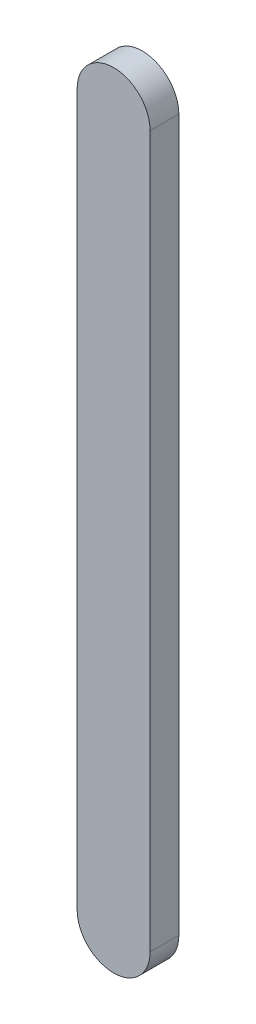
ISO-10303-21;
HEADER;
FILE_DESCRIPTION(('STEP AP214'),'2;1');
FILE_NAME('part.step','',(''),(''),'','','');
FILE_SCHEMA(('AUTOMOTIVE_DESIGN { 1 0 10303 214 1 1 1 1 }'));
ENDSEC;
DATA;
#1=APPLICATION_CONTEXT('core data for automotive mechanical design processes');
#2=APPLICATION_PROTOCOL_DEFINITION('international standard','automotive_design',2000,#1);
#3=PRODUCT_CONTEXT('',#1,'mechanical');
#4=PRODUCT('Part','Part','',(#3));
#5=PRODUCT_RELATED_PRODUCT_CATEGORY('part','',(#4));
#6=PRODUCT_DEFINITION_FORMATION('','',#4);
#7=PRODUCT_DEFINITION_CONTEXT('part definition',#1,'design');
#8=PRODUCT_DEFINITION('design','',#6,#7);
#9=PRODUCT_DEFINITION_SHAPE('','',#8);
#10=(LENGTH_UNIT() NAMED_UNIT(*) SI_UNIT(.MILLI.,.METRE.));
#11=(NAMED_UNIT(*) PLANE_ANGLE_UNIT() SI_UNIT($,.RADIAN.));
#12=(NAMED_UNIT(*) SI_UNIT($,.STERADIAN.) SOLID_ANGLE_UNIT());
#13=UNCERTAINTY_MEASURE_WITH_UNIT(LENGTH_MEASURE(1.E-05),#10,'distance_accuracy_value','');
#14=(GEOMETRIC_REPRESENTATION_CONTEXT(3) GLOBAL_UNCERTAINTY_ASSIGNED_CONTEXT((#13)) GLOBAL_UNIT_ASSIGNED_CONTEXT((#10,
#11,#12)) REPRESENTATION_CONTEXT('',''));
#15=CARTESIAN_POINT('',(0.,0.,0.));
#16=DIRECTION('',(0.,0.,1.));
#17=DIRECTION('',(1.,0.,0.));
#18=AXIS2_PLACEMENT_3D('',#15,#16,#17);
#19=CARTESIAN_POINT('',(92.456,114.173,0.));
#20=DIRECTION('',(-1.,0.,0.));
#21=DIRECTION('',(0.,1.,0.));
#22=AXIS2_PLACEMENT_3D('',#19,#20,#21);
#23=PLANE('',#22);
#24=DIRECTION('',(0.,1.,0.));
#25=VECTOR('',#24,1.);
#26=CARTESIAN_POINT('',(92.456,114.173,0.1999996));
#27=LINE('',#26,#25);
#28=CARTESIAN_POINT('',(92.456,114.173,0.1999996));
#29=VERTEX_POINT('',#28);
#30=CARTESIAN_POINT('',(92.456,119.126,0.1999996));
#31=VERTEX_POINT('',#30);
#32=EDGE_CURVE('E11',#29,#31,#27,.T.);
#33=ORIENTED_EDGE('',*,*,#32,.F.);
#34=DIRECTION('',(0.,0.,1.));
#35=VECTOR('',#34,1.);
#36=CARTESIAN_POINT('',(92.456,114.173,0.));
#37=LINE('',#36,#35);
#38=CARTESIAN_POINT('',(92.456,114.173,0.));
#39=VERTEX_POINT('',#38);
#40=EDGE_CURVE('E24',#39,#29,#37,.T.);
#41=ORIENTED_EDGE('',*,*,#40,.F.);
#42=DIRECTION('',(0.,1.,0.));
#43=VECTOR('',#42,1.);
#44=CARTESIAN_POINT('',(92.456,114.173,0.));
#45=LINE('',#44,#43);
#46=CARTESIAN_POINT('',(92.456,119.126,0.));
#47=VERTEX_POINT('',#46);
#48=EDGE_CURVE('E75',#39,#47,#45,.T.);
#49=ORIENTED_EDGE('',*,*,#48,.T.);
#50=DIRECTION('',(0.,0.,1.));
#51=VECTOR('',#50,1.);
#52=CARTESIAN_POINT('',(92.456,119.126,0.));
#53=LINE('',#52,#51);
#54=EDGE_CURVE('E37',#47,#31,#53,.T.);
#55=ORIENTED_EDGE('',*,*,#54,.T.);
#56=EDGE_LOOP('',(#33,#41,#49,#55));
#57=FACE_BOUND('',#56,.T.);
#58=ADVANCED_FACE('F17',(#57),#23,.F.);
#59=CARTESIAN_POINT('',(92.202,119.126,0.));
#60=DIRECTION('',(0.,0.,-1.));
#61=DIRECTION('',(1.,1.11896493820486E-13,0.));
#62=AXIS2_PLACEMENT_3D('',#59,#60,#61);
#63=CYLINDRICAL_SURFACE('',#62,0.25400000000001);
#64=CARTESIAN_POINT('',(92.202,119.126,0.1999996));
#65=DIRECTION('',(0.,0.,1.));
#66=DIRECTION('',(1.,1.11896493820486E-13,0.));
#67=AXIS2_PLACEMENT_3D('',#64,#65,#66);
#68=CIRCLE('',#67,0.25400000000001);
#69=CARTESIAN_POINT('',(91.948,119.126,0.1999996));
#70=VERTEX_POINT('',#69);
#71=EDGE_CURVE('E83',#31,#70,#68,.T.);
#72=ORIENTED_EDGE('',*,*,#71,.F.);
#73=ORIENTED_EDGE('',*,*,#54,.F.);
#74=CARTESIAN_POINT('',(92.202,119.126,0.));
#75=DIRECTION('',(0.,0.,1.));
#76=DIRECTION('',(1.,1.11896493820486E-13,0.));
#77=AXIS2_PLACEMENT_3D('',#74,#75,#76);
#78=CIRCLE('',#77,0.25400000000001);
#79=CARTESIAN_POINT('',(91.948,119.126,0.));
#80=VERTEX_POINT('',#79);
#81=EDGE_CURVE('E81',#47,#80,#78,.T.);
#82=ORIENTED_EDGE('',*,*,#81,.T.);
#83=DIRECTION('',(0.,0.,1.));
#84=VECTOR('',#83,1.);
#85=CARTESIAN_POINT('',(91.948,119.126,0.));
#86=LINE('',#85,#84);
#87=EDGE_CURVE('E67',#80,#70,#86,.T.);
#88=ORIENTED_EDGE('',*,*,#87,.T.);
#89=EDGE_LOOP('',(#72,#73,#82,#88));
#90=FACE_BOUND('',#89,.T.);
#91=ADVANCED_FACE('F89',(#90),#63,.T.);
#92=CARTESIAN_POINT('',(91.948,119.126,0.));
#93=DIRECTION('',(1.,0.,0.));
#94=DIRECTION('',(0.,-1.,0.));
#95=AXIS2_PLACEMENT_3D('',#92,#93,#94);
#96=PLANE('',#95);
#97=DIRECTION('',(0.,-1.,0.));
#98=VECTOR('',#97,1.);
#99=CARTESIAN_POINT('',(91.948,119.126,0.1999996));
#100=LINE('',#99,#98);
#101=CARTESIAN_POINT('',(91.948,114.173,0.1999996));
#102=VERTEX_POINT('',#101);
#103=EDGE_CURVE('E71',#70,#102,#100,.T.);
#104=ORIENTED_EDGE('',*,*,#103,.F.);
#105=ORIENTED_EDGE('',*,*,#87,.F.);
#106=DIRECTION('',(0.,-1.,0.));
#107=VECTOR('',#106,1.);
#108=CARTESIAN_POINT('',(91.948,119.126,0.));
#109=LINE('',#108,#107);
#110=CARTESIAN_POINT('',(91.948,114.173,0.));
#111=VERTEX_POINT('',#110);
#112=EDGE_CURVE('E63',#80,#111,#109,.T.);
#113=ORIENTED_EDGE('',*,*,#112,.T.);
#114=DIRECTION('',(0.,0.,1.));
#115=VECTOR('',#114,1.);
#116=CARTESIAN_POINT('',(91.948,114.173,0.));
#117=LINE('',#116,#115);
#118=EDGE_CURVE('E53',#111,#102,#117,.T.);
#119=ORIENTED_EDGE('',*,*,#118,.T.);
#120=EDGE_LOOP('',(#104,#105,#113,#119));
#121=FACE_BOUND('',#120,.T.);
#122=ADVANCED_FACE('F66',(#121),#96,.F.);
#123=CARTESIAN_POINT('',(92.202,114.173,0.));
#124=DIRECTION('',(0.,0.,-1.));
#125=DIRECTION('',(-1.,0.,0.));
#126=AXIS2_PLACEMENT_3D('',#123,#124,#125);
#127=CYLINDRICAL_SURFACE('',#126,0.254000000000005);
#128=CARTESIAN_POINT('',(92.202,114.173,0.1999996));
#129=DIRECTION('',(0.,0.,1.));
#130=DIRECTION('',(-1.,0.,0.));
#131=AXIS2_PLACEMENT_3D('',#128,#129,#130);
#132=CIRCLE('',#131,0.254000000000005);
#133=EDGE_CURVE('E59',#102,#29,#132,.T.);
#134=ORIENTED_EDGE('',*,*,#133,.F.);
#135=ORIENTED_EDGE('',*,*,#118,.F.);
#136=CARTESIAN_POINT('',(92.202,114.173,0.));
#137=DIRECTION('',(0.,0.,1.));
#138=DIRECTION('',(-1.,0.,0.));
#139=AXIS2_PLACEMENT_3D('',#136,#137,#138);
#140=CIRCLE('',#139,0.254000000000005);
#141=EDGE_CURVE('E57',#111,#39,#140,.T.);
#142=ORIENTED_EDGE('',*,*,#141,.T.);
#143=ORIENTED_EDGE('',*,*,#40,.T.);
#144=EDGE_LOOP('',(#134,#135,#142,#143));
#145=FACE_BOUND('',#144,.T.);
#146=ADVANCED_FACE('F55',(#145),#127,.T.);
#147=CARTESIAN_POINT('',(92.456,114.173,0.));
#148=DIRECTION('',(0.,0.,-1.));
#149=DIRECTION('',(-1.,0.,0.));
#150=AXIS2_PLACEMENT_3D('',#147,#148,#149);
#151=PLANE('',#150);
#152=ORIENTED_EDGE('',*,*,#141,.F.);
#153=ORIENTED_EDGE('',*,*,#112,.F.);
#154=ORIENTED_EDGE('',*,*,#81,.F.);
#155=ORIENTED_EDGE('',*,*,#48,.F.);
#156=EDGE_LOOP('',(#152,#153,#154,#155));
#157=FACE_BOUND('',#156,.T.);
#158=ADVANCED_FACE('F74',(#157),#151,.T.);
#159=CARTESIAN_POINT('',(92.456,114.173,0.1999996));
#160=DIRECTION('',(0.,0.,-1.));
#161=DIRECTION('',(-1.,0.,0.));
#162=AXIS2_PLACEMENT_3D('',#159,#160,#161);
#163=PLANE('',#162);
#164=ORIENTED_EDGE('',*,*,#32,.T.);
#165=ORIENTED_EDGE('',*,*,#71,.T.);
#166=ORIENTED_EDGE('',*,*,#103,.T.);
#167=ORIENTED_EDGE('',*,*,#133,.T.);
#168=EDGE_LOOP('',(#164,#165,#166,#167));
#169=FACE_BOUND('',#168,.T.);
#170=ADVANCED_FACE('F91',(#169),#163,.F.);
#171=CLOSED_SHELL('',(#58,#91,#122,#146,#158,#170));
#172=MANIFOLD_SOLID_BREP('B1',#171);
#173=ADVANCED_BREP_SHAPE_REPRESENTATION('',(#18,#172),#14);
#174=SHAPE_DEFINITION_REPRESENTATION(#9,#173);
ENDSEC;
END-ISO-10303-21;
